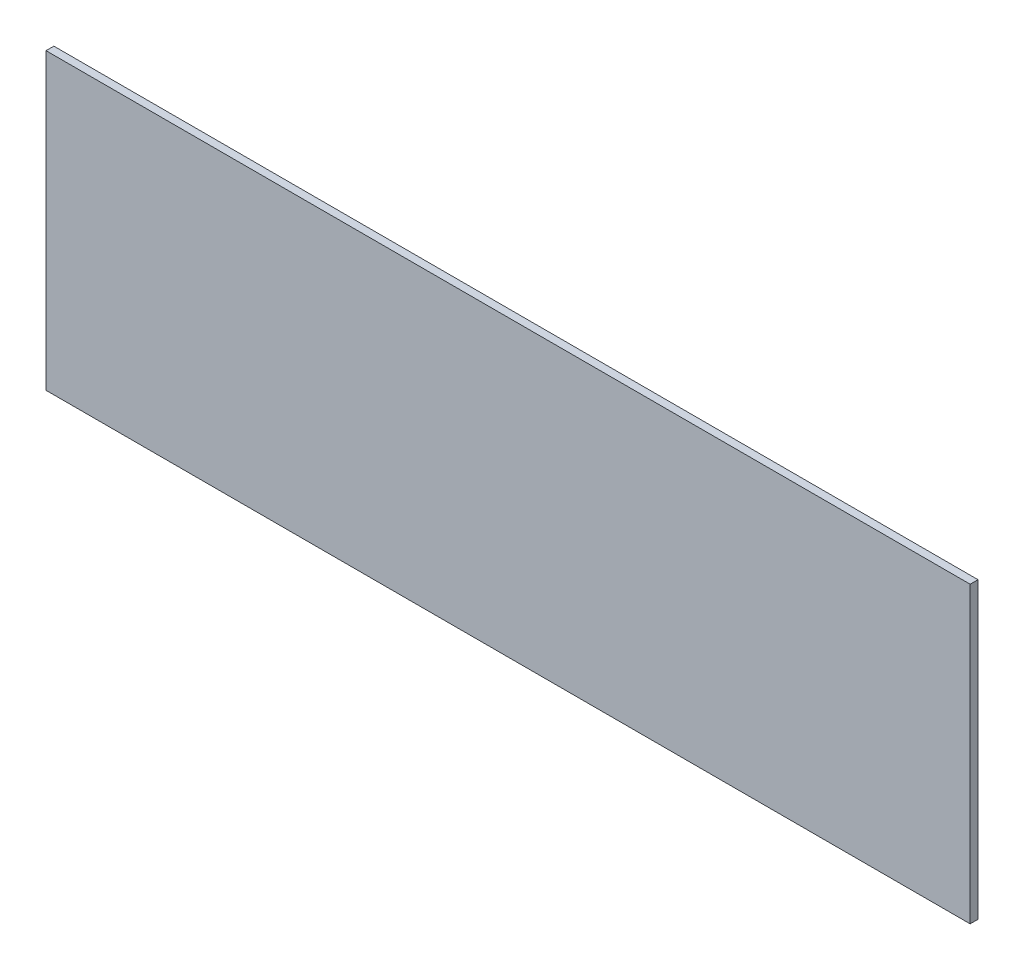
ISO-10303-21;
HEADER;
FILE_DESCRIPTION(('STEP AP214'),'2;1');
FILE_NAME('part.step','',(''),(''),'','','');
FILE_SCHEMA(('AUTOMOTIVE_DESIGN { 1 0 10303 214 1 1 1 1 }'));
ENDSEC;
DATA;
#1=APPLICATION_CONTEXT('core data for automotive mechanical design processes');
#2=APPLICATION_PROTOCOL_DEFINITION('international standard','automotive_design',2000,#1);
#3=PRODUCT_CONTEXT('',#1,'mechanical');
#4=PRODUCT('Part','Part','',(#3));
#5=PRODUCT_RELATED_PRODUCT_CATEGORY('part','',(#4));
#6=PRODUCT_DEFINITION_FORMATION('','',#4);
#7=PRODUCT_DEFINITION_CONTEXT('part definition',#1,'design');
#8=PRODUCT_DEFINITION('design','',#6,#7);
#9=PRODUCT_DEFINITION_SHAPE('','',#8);
#10=(LENGTH_UNIT() NAMED_UNIT(*) SI_UNIT(.MILLI.,.METRE.));
#11=(NAMED_UNIT(*) PLANE_ANGLE_UNIT() SI_UNIT($,.RADIAN.));
#12=(NAMED_UNIT(*) SI_UNIT($,.STERADIAN.) SOLID_ANGLE_UNIT());
#13=UNCERTAINTY_MEASURE_WITH_UNIT(LENGTH_MEASURE(1.E-05),#10,'distance_accuracy_value','');
#14=(GEOMETRIC_REPRESENTATION_CONTEXT(3) GLOBAL_UNCERTAINTY_ASSIGNED_CONTEXT((#13)) GLOBAL_UNIT_ASSIGNED_CONTEXT((#10,
#11,#12)) REPRESENTATION_CONTEXT('',''));
#15=CARTESIAN_POINT('',(0.,0.,0.));
#16=DIRECTION('',(0.,0.,1.));
#17=DIRECTION('',(1.,0.,0.));
#18=AXIS2_PLACEMENT_3D('',#15,#16,#17);
#19=CARTESIAN_POINT('',(-94.25,-30.,1.6));
#20=DIRECTION('',(1.,0.,0.));
#21=DIRECTION('',(0.,0.,-1.));
#22=AXIS2_PLACEMENT_3D('',#19,#20,#21);
#23=PLANE('',#22);
#24=DIRECTION('',(0.,-1.,0.));
#25=VECTOR('',#24,1.);
#26=CARTESIAN_POINT('',(-94.25,-30.,0.));
#27=LINE('',#26,#25);
#28=CARTESIAN_POINT('',(-94.25,30.,0.));
#29=VERTEX_POINT('',#28);
#30=CARTESIAN_POINT('',(-94.25,-30.,0.));
#31=VERTEX_POINT('',#30);
#32=EDGE_CURVE('E99',#29,#31,#27,.T.);
#33=ORIENTED_EDGE('',*,*,#32,.T.);
#34=DIRECTION('',(0.,0.,-1.));
#35=VECTOR('',#34,1.);
#36=CARTESIAN_POINT('',(-94.25,-30.,1.6));
#37=LINE('',#36,#35);
#38=CARTESIAN_POINT('',(-94.25,-30.,1.6));
#39=VERTEX_POINT('',#38);
#40=EDGE_CURVE('E11',#39,#31,#37,.T.);
#41=ORIENTED_EDGE('',*,*,#40,.F.);
#42=DIRECTION('',(0.,-1.,0.));
#43=VECTOR('',#42,1.);
#44=CARTESIAN_POINT('',(-94.25,-30.,1.6));
#45=LINE('',#44,#43);
#46=CARTESIAN_POINT('',(-94.25,30.,1.6));
#47=VERTEX_POINT('',#46);
#48=EDGE_CURVE('E87',#47,#39,#45,.T.);
#49=ORIENTED_EDGE('',*,*,#48,.F.);
#50=DIRECTION('',(0.,0.,-1.));
#51=VECTOR('',#50,1.);
#52=CARTESIAN_POINT('',(-94.25,30.,1.6));
#53=LINE('',#52,#51);
#54=EDGE_CURVE('E95',#47,#29,#53,.T.);
#55=ORIENTED_EDGE('',*,*,#54,.T.);
#56=EDGE_LOOP('',(#33,#41,#49,#55));
#57=FACE_BOUND('',#56,.T.);
#58=ADVANCED_FACE('F36',(#57),#23,.F.);
#59=CARTESIAN_POINT('',(94.25,-30.,1.6));
#60=DIRECTION('',(0.,1.,0.));
#61=DIRECTION('',(-1.,0.,0.));
#62=AXIS2_PLACEMENT_3D('',#59,#60,#61);
#63=PLANE('',#62);
#64=DIRECTION('',(1.,0.,0.));
#65=VECTOR('',#64,1.);
#66=CARTESIAN_POINT('',(94.25,-30.,0.));
#67=LINE('',#66,#65);
#68=CARTESIAN_POINT('',(94.25,-30.,0.));
#69=VERTEX_POINT('',#68);
#70=EDGE_CURVE('E91',#31,#69,#67,.T.);
#71=ORIENTED_EDGE('',*,*,#70,.T.);
#72=DIRECTION('',(0.,0.,-1.));
#73=VECTOR('',#72,1.);
#74=CARTESIAN_POINT('',(94.25,-30.,1.6));
#75=LINE('',#74,#73);
#76=CARTESIAN_POINT('',(94.25,-30.,1.6));
#77=VERTEX_POINT('',#76);
#78=EDGE_CURVE('E44',#77,#69,#75,.T.);
#79=ORIENTED_EDGE('',*,*,#78,.F.);
#80=DIRECTION('',(1.,0.,0.));
#81=VECTOR('',#80,1.);
#82=CARTESIAN_POINT('',(94.25,-30.,1.6));
#83=LINE('',#82,#81);
#84=EDGE_CURVE('E82',#39,#77,#83,.T.);
#85=ORIENTED_EDGE('',*,*,#84,.F.);
#86=ORIENTED_EDGE('',*,*,#40,.T.);
#87=EDGE_LOOP('',(#71,#79,#85,#86));
#88=FACE_BOUND('',#87,.T.);
#89=ADVANCED_FACE('F90',(#88),#63,.F.);
#90=CARTESIAN_POINT('',(94.25,-30.,1.6));
#91=DIRECTION('',(-1.,0.,0.));
#92=DIRECTION('',(0.,0.,1.));
#93=AXIS2_PLACEMENT_3D('',#90,#91,#92);
#94=PLANE('',#93);
#95=DIRECTION('',(0.,1.,0.));
#96=VECTOR('',#95,1.);
#97=CARTESIAN_POINT('',(94.25,-30.,0.));
#98=LINE('',#97,#96);
#99=CARTESIAN_POINT('',(94.25,30.,0.));
#100=VERTEX_POINT('',#99);
#101=EDGE_CURVE('E69',#69,#100,#98,.T.);
#102=ORIENTED_EDGE('',*,*,#101,.T.);
#103=DIRECTION('',(0.,0.,-1.));
#104=VECTOR('',#103,1.);
#105=CARTESIAN_POINT('',(94.25,30.,1.6));
#106=LINE('',#105,#104);
#107=CARTESIAN_POINT('',(94.25,30.,1.6));
#108=VERTEX_POINT('',#107);
#109=EDGE_CURVE('E92',#108,#100,#106,.T.);
#110=ORIENTED_EDGE('',*,*,#109,.F.);
#111=DIRECTION('',(0.,1.,0.));
#112=VECTOR('',#111,1.);
#113=CARTESIAN_POINT('',(94.25,-30.,1.6));
#114=LINE('',#113,#112);
#115=EDGE_CURVE('E85',#77,#108,#114,.T.);
#116=ORIENTED_EDGE('',*,*,#115,.F.);
#117=ORIENTED_EDGE('',*,*,#78,.T.);
#118=EDGE_LOOP('',(#102,#110,#116,#117));
#119=FACE_BOUND('',#118,.T.);
#120=ADVANCED_FACE('F93',(#119),#94,.F.);
#121=CARTESIAN_POINT('',(94.25,30.,1.6));
#122=DIRECTION('',(0.,-1.,0.));
#123=DIRECTION('',(1.,0.,0.));
#124=AXIS2_PLACEMENT_3D('',#121,#122,#123);
#125=PLANE('',#124);
#126=DIRECTION('',(-1.,0.,0.));
#127=VECTOR('',#126,1.);
#128=CARTESIAN_POINT('',(94.25,30.,0.));
#129=LINE('',#128,#127);
#130=EDGE_CURVE('E75',#100,#29,#129,.T.);
#131=ORIENTED_EDGE('',*,*,#130,.T.);
#132=ORIENTED_EDGE('',*,*,#54,.F.);
#133=DIRECTION('',(-1.,0.,0.));
#134=VECTOR('',#133,1.);
#135=CARTESIAN_POINT('',(94.25,30.,1.6));
#136=LINE('',#135,#134);
#137=EDGE_CURVE('E52',#108,#47,#136,.T.);
#138=ORIENTED_EDGE('',*,*,#137,.F.);
#139=ORIENTED_EDGE('',*,*,#109,.T.);
#140=EDGE_LOOP('',(#131,#132,#138,#139));
#141=FACE_BOUND('',#140,.T.);
#142=ADVANCED_FACE('F106',(#141),#125,.F.);
#143=CARTESIAN_POINT('',(0.,0.,1.6));
#144=DIRECTION('',(0.,0.,1.));
#145=DIRECTION('',(1.,0.,0.));
#146=AXIS2_PLACEMENT_3D('',#143,#144,#145);
#147=PLANE('',#146);
#148=ORIENTED_EDGE('',*,*,#48,.T.);
#149=ORIENTED_EDGE('',*,*,#84,.T.);
#150=ORIENTED_EDGE('',*,*,#115,.T.);
#151=ORIENTED_EDGE('',*,*,#137,.T.);
#152=EDGE_LOOP('',(#148,#149,#150,#151));
#153=FACE_BOUND('',#152,.T.);
#154=ADVANCED_FACE('F83',(#153),#147,.T.);
#155=CARTESIAN_POINT('',(0.,0.,0.));
#156=DIRECTION('',(0.,0.,1.));
#157=DIRECTION('',(1.,0.,0.));
#158=AXIS2_PLACEMENT_3D('',#155,#156,#157);
#159=PLANE('',#158);
#160=ORIENTED_EDGE('',*,*,#32,.F.);
#161=ORIENTED_EDGE('',*,*,#130,.F.);
#162=ORIENTED_EDGE('',*,*,#101,.F.);
#163=ORIENTED_EDGE('',*,*,#70,.F.);
#164=EDGE_LOOP('',(#160,#161,#162,#163));
#165=FACE_BOUND('',#164,.T.);
#166=ADVANCED_FACE('F109',(#165),#159,.F.);
#167=CLOSED_SHELL('',(#58,#89,#120,#142,#154,#166));
#168=MANIFOLD_SOLID_BREP('B2',#167);
#169=ADVANCED_BREP_SHAPE_REPRESENTATION('',(#18,#168),#14);
#170=SHAPE_DEFINITION_REPRESENTATION(#9,#169);
ENDSEC;
END-ISO-10303-21;
